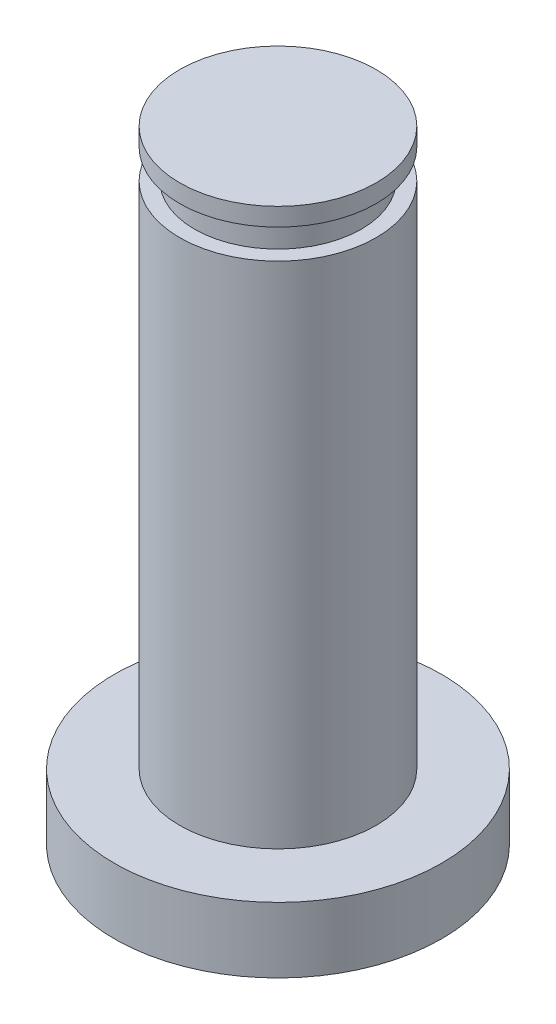
ISO-10303-21;
HEADER;
FILE_DESCRIPTION(('STEP AP214'),'2;1');
FILE_NAME('part.step','',(''),(''),'','','');
FILE_SCHEMA(('AUTOMOTIVE_DESIGN { 1 0 10303 214 1 1 1 1 }'));
ENDSEC;
DATA;
#1=APPLICATION_CONTEXT('core data for automotive mechanical design processes');
#2=APPLICATION_PROTOCOL_DEFINITION('international standard','automotive_design',2000,#1);
#3=PRODUCT_CONTEXT('',#1,'mechanical');
#4=PRODUCT('Part','Part','',(#3));
#5=PRODUCT_RELATED_PRODUCT_CATEGORY('part','',(#4));
#6=PRODUCT_DEFINITION_FORMATION('','',#4);
#7=PRODUCT_DEFINITION_CONTEXT('part definition',#1,'design');
#8=PRODUCT_DEFINITION('design','',#6,#7);
#9=PRODUCT_DEFINITION_SHAPE('','',#8);
#10=(LENGTH_UNIT() NAMED_UNIT(*) SI_UNIT(.MILLI.,.METRE.));
#11=(NAMED_UNIT(*) PLANE_ANGLE_UNIT() SI_UNIT($,.RADIAN.));
#12=(NAMED_UNIT(*) SI_UNIT($,.STERADIAN.) SOLID_ANGLE_UNIT());
#13=UNCERTAINTY_MEASURE_WITH_UNIT(LENGTH_MEASURE(1.E-05),#10,'distance_accuracy_value','');
#14=(GEOMETRIC_REPRESENTATION_CONTEXT(3) GLOBAL_UNCERTAINTY_ASSIGNED_CONTEXT((#13)) GLOBAL_UNIT_ASSIGNED_CONTEXT((#10,
#11,#12)) REPRESENTATION_CONTEXT('',''));
#15=CARTESIAN_POINT('',(0.,0.,0.));
#16=DIRECTION('',(0.,0.,1.));
#17=DIRECTION('',(1.,0.,0.));
#18=AXIS2_PLACEMENT_3D('',#15,#16,#17);
#19=CARTESIAN_POINT('',(-15.,-151.,135.));
#20=DIRECTION('',(0.,-1.,0.));
#21=DIRECTION('',(-1.,0.,0.));
#22=AXIS2_PLACEMENT_3D('',#19,#20,#21);
#23=PLANE('',#22);
#24=CARTESIAN_POINT('',(-15.,-151.,135.));
#25=DIRECTION('',(0.,-1.,0.));
#26=DIRECTION('',(1.,0.,0.));
#27=AXIS2_PLACEMENT_3D('',#24,#25,#26);
#28=CIRCLE('',#27,3.);
#29=CARTESIAN_POINT('',(-12.,-151.,135.));
#30=VERTEX_POINT('',#29);
#31=EDGE_CURVE('E11',#30,#30,#28,.T.);
#32=ORIENTED_EDGE('',*,*,#31,.F.);
#33=EDGE_LOOP('',(#32));
#34=FACE_BOUND('',#33,.T.);
#35=ADVANCED_FACE('F16',(#34),#23,.F.);
#36=CARTESIAN_POINT('',(-15.,-151.,135.));
#37=DIRECTION('',(0.,-1.,0.));
#38=DIRECTION('',(1.,0.,0.));
#39=AXIS2_PLACEMENT_3D('',#36,#37,#38);
#40=CYLINDRICAL_SURFACE('',#39,3.);
#41=CARTESIAN_POINT('',(-15.,-151.55,135.));
#42=DIRECTION('',(0.,-1.,0.));
#43=DIRECTION('',(1.,0.,0.));
#44=AXIS2_PLACEMENT_3D('',#41,#42,#43);
#45=CIRCLE('',#44,3.);
#46=CARTESIAN_POINT('',(-12.,-151.55,135.));
#47=VERTEX_POINT('',#46);
#48=EDGE_CURVE('E92',#47,#47,#45,.T.);
#49=ORIENTED_EDGE('',*,*,#48,.F.);
#50=DIRECTION('',(0.,-1.,0.));
#51=VECTOR('',#50,1.);
#52=CARTESIAN_POINT('',(-12.,-151.,135.));
#53=LINE('',#52,#51);
#54=EDGE_CURVE('E19',#30,#47,#53,.T.);
#55=ORIENTED_EDGE('',*,*,#54,.F.);
#56=ORIENTED_EDGE('',*,*,#31,.T.);
#57=ORIENTED_EDGE('',*,*,#54,.T.);
#58=EDGE_LOOP('',(#49,#55,#56,#57));
#59=FACE_BOUND('',#58,.T.);
#60=ADVANCED_FACE('F169',(#59),#40,.T.);
#61=CARTESIAN_POINT('',(-15.,-151.55,135.));
#62=DIRECTION('',(0.,-1.,0.));
#63=DIRECTION('',(-1.,0.,0.));
#64=AXIS2_PLACEMENT_3D('',#61,#62,#63);
#65=PLANE('',#64);
#66=CARTESIAN_POINT('',(-15.,-151.55,135.));
#67=DIRECTION('',(0.,-1.,0.));
#68=DIRECTION('',(1.,0.,0.));
#69=AXIS2_PLACEMENT_3D('',#66,#67,#68);
#70=CIRCLE('',#69,2.55);
#71=CARTESIAN_POINT('',(-12.45,-151.55,135.));
#72=VERTEX_POINT('',#71);
#73=EDGE_CURVE('E89',#72,#72,#70,.T.);
#74=ORIENTED_EDGE('',*,*,#73,.F.);
#75=EDGE_LOOP('',(#74));
#76=FACE_BOUND('',#75,.T.);
#77=ORIENTED_EDGE('',*,*,#48,.T.);
#78=EDGE_LOOP('',(#77));
#79=FACE_BOUND('',#78,.T.);
#80=ADVANCED_FACE('F160',(#76,#79),#65,.T.);
#81=CARTESIAN_POINT('',(-15.,-151.45,135.));
#82=DIRECTION('',(0.,-1.,0.));
#83=DIRECTION('',(1.,0.,0.));
#84=AXIS2_PLACEMENT_3D('',#81,#82,#83);
#85=CYLINDRICAL_SURFACE('',#84,2.55);
#86=CARTESIAN_POINT('',(-15.,-152.45,135.));
#87=DIRECTION('',(0.,-1.,0.));
#88=DIRECTION('',(1.,0.,0.));
#89=AXIS2_PLACEMENT_3D('',#86,#87,#88);
#90=CIRCLE('',#89,2.55);
#91=CARTESIAN_POINT('',(-12.45,-152.45,135.));
#92=VERTEX_POINT('',#91);
#93=EDGE_CURVE('E83',#92,#92,#90,.T.);
#94=ORIENTED_EDGE('',*,*,#93,.F.);
#95=DIRECTION('',(0.,-1.,0.));
#96=VECTOR('',#95,1.);
#97=CARTESIAN_POINT('',(-12.45,-151.45,135.));
#98=LINE('',#97,#96);
#99=EDGE_CURVE('E93',#72,#92,#98,.T.);
#100=ORIENTED_EDGE('',*,*,#99,.F.);
#101=ORIENTED_EDGE('',*,*,#73,.T.);
#102=ORIENTED_EDGE('',*,*,#99,.T.);
#103=EDGE_LOOP('',(#94,#100,#101,#102));
#104=FACE_BOUND('',#103,.T.);
#105=ADVANCED_FACE('F151',(#104),#85,.T.);
#106=CARTESIAN_POINT('',(-15.,-152.45,135.));
#107=DIRECTION('',(0.,-1.,0.));
#108=DIRECTION('',(-1.,0.,0.));
#109=AXIS2_PLACEMENT_3D('',#106,#107,#108);
#110=PLANE('',#109);
#111=ORIENTED_EDGE('',*,*,#93,.T.);
#112=EDGE_LOOP('',(#111));
#113=FACE_BOUND('',#112,.T.);
#114=CARTESIAN_POINT('',(-15.,-152.45,135.));
#115=DIRECTION('',(0.,-1.,0.));
#116=DIRECTION('',(1.,0.,0.));
#117=AXIS2_PLACEMENT_3D('',#114,#115,#116);
#118=CIRCLE('',#117,3.);
#119=CARTESIAN_POINT('',(-12.,-152.45,135.));
#120=VERTEX_POINT('',#119);
#121=EDGE_CURVE('E82',#120,#120,#118,.T.);
#122=ORIENTED_EDGE('',*,*,#121,.F.);
#123=EDGE_LOOP('',(#122));
#124=FACE_BOUND('',#123,.T.);
#125=ADVANCED_FACE('F142',(#113,#124),#110,.F.);
#126=CARTESIAN_POINT('',(-15.,-151.,135.));
#127=DIRECTION('',(0.,-1.,0.));
#128=DIRECTION('',(1.,0.,0.));
#129=AXIS2_PLACEMENT_3D('',#126,#127,#128);
#130=CYLINDRICAL_SURFACE('',#129,3.);
#131=DIRECTION('',(0.,-1.,0.));
#132=VECTOR('',#131,1.);
#133=CARTESIAN_POINT('',(-12.,-151.,135.));
#134=LINE('',#133,#132);
#135=CARTESIAN_POINT('',(-12.,-168.,135.));
#136=VERTEX_POINT('',#135);
#137=EDGE_CURVE('E84',#120,#136,#134,.T.);
#138=ORIENTED_EDGE('',*,*,#137,.T.);
#139=CARTESIAN_POINT('',(-15.,-168.,135.));
#140=DIRECTION('',(0.,-1.,0.));
#141=DIRECTION('',(1.,0.,0.));
#142=AXIS2_PLACEMENT_3D('',#139,#140,#141);
#143=CIRCLE('',#142,3.);
#144=EDGE_CURVE('E88',#136,#136,#143,.T.);
#145=ORIENTED_EDGE('',*,*,#144,.F.);
#146=ORIENTED_EDGE('',*,*,#137,.F.);
#147=ORIENTED_EDGE('',*,*,#121,.T.);
#148=EDGE_LOOP('',(#138,#145,#146,#147));
#149=FACE_BOUND('',#148,.T.);
#150=ADVANCED_FACE('F133',(#149),#130,.T.);
#151=CARTESIAN_POINT('',(-15.,-168.,135.));
#152=DIRECTION('',(0.,-1.,0.));
#153=DIRECTION('',(-1.,0.,0.));
#154=AXIS2_PLACEMENT_3D('',#151,#152,#153);
#155=PLANE('',#154);
#156=ORIENTED_EDGE('',*,*,#144,.T.);
#157=EDGE_LOOP('',(#156));
#158=FACE_BOUND('',#157,.T.);
#159=CARTESIAN_POINT('',(-15.,-168.,135.));
#160=DIRECTION('',(0.,-1.,0.));
#161=DIRECTION('',(1.,0.,0.));
#162=AXIS2_PLACEMENT_3D('',#159,#160,#161);
#163=CIRCLE('',#162,5.);
#164=CARTESIAN_POINT('',(-10.,-168.,135.));
#165=VERTEX_POINT('',#164);
#166=EDGE_CURVE('E72',#165,#165,#163,.T.);
#167=ORIENTED_EDGE('',*,*,#166,.F.);
#168=EDGE_LOOP('',(#167));
#169=FACE_BOUND('',#168,.T.);
#170=ADVANCED_FACE('F125',(#158,#169),#155,.F.);
#171=CARTESIAN_POINT('',(-15.,-170.,135.));
#172=DIRECTION('',(0.,-1.,0.));
#173=DIRECTION('',(-1.,0.,0.));
#174=AXIS2_PLACEMENT_3D('',#171,#172,#173);
#175=PLANE('',#174);
#176=CARTESIAN_POINT('',(-15.,-170.,135.));
#177=DIRECTION('',(0.,-1.,0.));
#178=DIRECTION('',(1.,0.,0.));
#179=AXIS2_PLACEMENT_3D('',#176,#177,#178);
#180=CIRCLE('',#179,5.);
#181=CARTESIAN_POINT('',(-10.,-170.,135.));
#182=VERTEX_POINT('',#181);
#183=EDGE_CURVE('E70',#182,#182,#180,.T.);
#184=ORIENTED_EDGE('',*,*,#183,.T.);
#185=EDGE_LOOP('',(#184));
#186=FACE_BOUND('',#185,.T.);
#187=ADVANCED_FACE('F76',(#186),#175,.T.);
#188=CARTESIAN_POINT('',(-15.,-168.,135.));
#189=DIRECTION('',(0.,-1.,0.));
#190=DIRECTION('',(1.,0.,0.));
#191=AXIS2_PLACEMENT_3D('',#188,#189,#190);
#192=CYLINDRICAL_SURFACE('',#191,5.);
#193=ORIENTED_EDGE('',*,*,#183,.F.);
#194=DIRECTION('',(0.,-1.,0.));
#195=VECTOR('',#194,1.);
#196=CARTESIAN_POINT('',(-10.,-168.,135.));
#197=LINE('',#196,#195);
#198=EDGE_CURVE('E67',#165,#182,#197,.T.);
#199=ORIENTED_EDGE('',*,*,#198,.F.);
#200=ORIENTED_EDGE('',*,*,#166,.T.);
#201=ORIENTED_EDGE('',*,*,#198,.T.);
#202=EDGE_LOOP('',(#193,#199,#200,#201));
#203=FACE_BOUND('',#202,.T.);
#204=ADVANCED_FACE('F69',(#203),#192,.T.);
#205=CLOSED_SHELL('',(#35,#60,#80,#105,#125,#150,#170,#187,#204));
#206=MANIFOLD_SOLID_BREP('B1',#205);
#207=ADVANCED_BREP_SHAPE_REPRESENTATION('',(#18,#206),#14);
#208=SHAPE_DEFINITION_REPRESENTATION(#9,#207);
ENDSEC;
END-ISO-10303-21;
